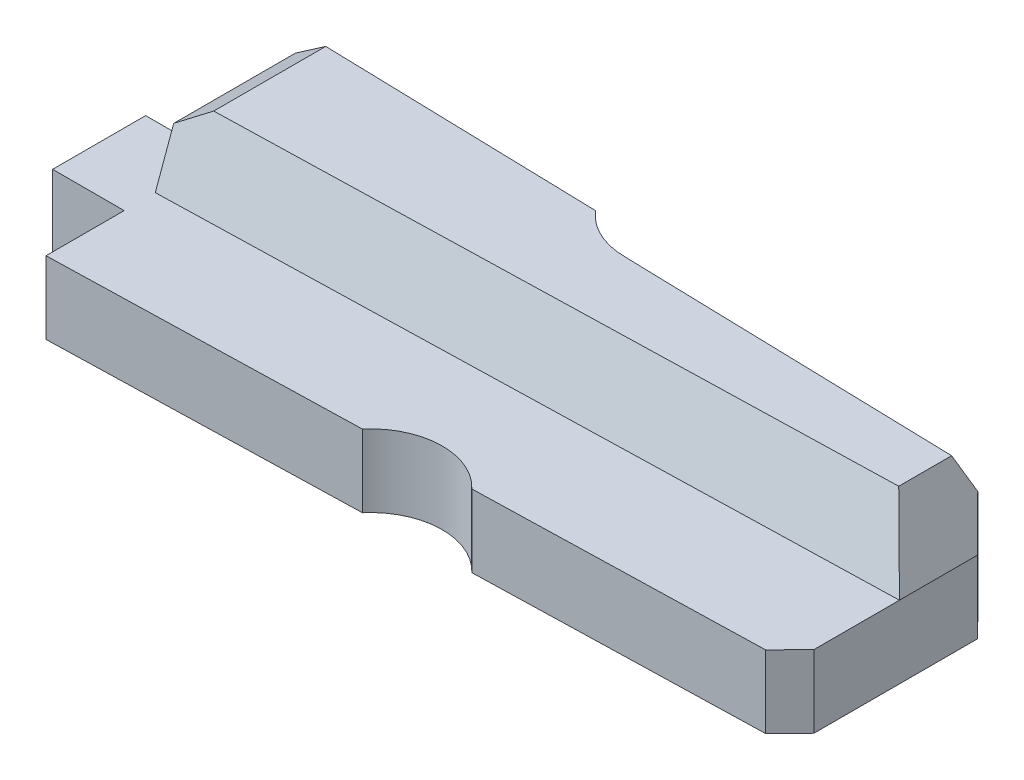
ISO-10303-21;
HEADER;
FILE_DESCRIPTION(('STEP AP214'),'2;1');
FILE_NAME('part.step','',(''),(''),'','','');
FILE_SCHEMA(('AUTOMOTIVE_DESIGN { 1 0 10303 214 1 1 1 1 }'));
ENDSEC;
DATA;
#1=APPLICATION_CONTEXT('core data for automotive mechanical design processes');
#2=APPLICATION_PROTOCOL_DEFINITION('international standard','automotive_design',2000,#1);
#3=PRODUCT_CONTEXT('',#1,'mechanical');
#4=PRODUCT('Part','Part','',(#3));
#5=PRODUCT_RELATED_PRODUCT_CATEGORY('part','',(#4));
#6=PRODUCT_DEFINITION_FORMATION('','',#4);
#7=PRODUCT_DEFINITION_CONTEXT('part definition',#1,'design');
#8=PRODUCT_DEFINITION('design','',#6,#7);
#9=PRODUCT_DEFINITION_SHAPE('','',#8);
#10=(LENGTH_UNIT() NAMED_UNIT(*) SI_UNIT(.MILLI.,.METRE.));
#11=(NAMED_UNIT(*) PLANE_ANGLE_UNIT() SI_UNIT($,.RADIAN.));
#12=(NAMED_UNIT(*) SI_UNIT($,.STERADIAN.) SOLID_ANGLE_UNIT());
#13=UNCERTAINTY_MEASURE_WITH_UNIT(LENGTH_MEASURE(1.E-05),#10,'distance_accuracy_value','');
#14=(GEOMETRIC_REPRESENTATION_CONTEXT(3) GLOBAL_UNCERTAINTY_ASSIGNED_CONTEXT((#13)) GLOBAL_UNIT_ASSIGNED_CONTEXT((#10,
#11,#12)) REPRESENTATION_CONTEXT('',''));
#15=CARTESIAN_POINT('',(0.,0.,0.));
#16=DIRECTION('',(0.,0.,1.));
#17=DIRECTION('',(1.,0.,0.));
#18=AXIS2_PLACEMENT_3D('',#15,#16,#17);
#19=CARTESIAN_POINT('',(-3.21404762394943,0.,0.));
#20=DIRECTION('',(-1.,0.,0.));
#21=DIRECTION('',(0.,0.,1.));
#22=AXIS2_PLACEMENT_3D('',#19,#20,#21);
#23=PLANE('',#22);
#24=DIRECTION('',(0.,-0.939654376033673,0.342125201645199));
#25=VECTOR('',#24,1.);
#26=CARTESIAN_POINT('',(-3.21404762394943,1.11739403174175,3.06894723519641));
#27=LINE('',#26,#25);
#28=CARTESIAN_POINT('',(-3.21404762394943,10.3388381168578,-0.28855154046747));
#29=VERTEX_POINT('',#28);
#30=CARTESIAN_POINT('',(-3.21404762394943,6.08,1.26207801723708));
#31=VERTEX_POINT('',#30);
#32=EDGE_CURVE('E38',#29,#31,#27,.T.);
#33=ORIENTED_EDGE('',*,*,#32,.F.);
#34=DIRECTION('',(0.,0.,1.));
#35=VECTOR('',#34,1.);
#36=CARTESIAN_POINT('',(-3.21404762394943,10.3388381168578,0.));
#37=LINE('',#36,#35);
#38=CARTESIAN_POINT('',(-3.21404762394943,10.3388381168578,-10.4866526126494));
#39=VERTEX_POINT('',#38);
#40=EDGE_CURVE('E50',#39,#29,#37,.T.);
#41=ORIENTED_EDGE('',*,*,#40,.F.);
#42=DIRECTION('',(0.,-1.,0.));
#43=VECTOR('',#42,1.);
#44=CARTESIAN_POINT('',(-3.21404762394943,6.08,-10.4866526126494));
#45=LINE('',#44,#43);
#46=CARTESIAN_POINT('',(-3.21404762394943,0.,-10.4866526126494));
#47=VERTEX_POINT('',#46);
#48=EDGE_CURVE('E321',#39,#47,#45,.T.);
#49=ORIENTED_EDGE('',*,*,#48,.T.);
#50=DIRECTION('',(0.,0.,1.));
#51=VECTOR('',#50,1.);
#52=CARTESIAN_POINT('',(-3.21404762394943,0.,0.));
#53=LINE('',#52,#51);
#54=CARTESIAN_POINT('',(-3.21404762394943,0.,-3.93069399195972));
#55=VERTEX_POINT('',#54);
#56=EDGE_CURVE('E355',#47,#55,#53,.T.);
#57=ORIENTED_EDGE('',*,*,#56,.T.);
#58=DIRECTION('',(0.,-1.,0.));
#59=VECTOR('',#58,1.);
#60=CARTESIAN_POINT('',(-3.21404762394943,6.08,-3.93069399195972));
#61=LINE('',#60,#59);
#62=CARTESIAN_POINT('',(-3.21404762394943,6.08,-3.93069399195972));
#63=VERTEX_POINT('',#62);
#64=EDGE_CURVE('E58',#63,#55,#61,.T.);
#65=ORIENTED_EDGE('',*,*,#64,.F.);
#66=DIRECTION('',(0.,0.,-1.));
#67=VECTOR('',#66,1.);
#68=CARTESIAN_POINT('',(-3.21404762394943,6.08,-3.93069399195972));
#69=LINE('',#68,#67);
#70=EDGE_CURVE('E11',#31,#63,#69,.T.);
#71=ORIENTED_EDGE('',*,*,#70,.F.);
#72=EDGE_LOOP('',(#33,#41,#49,#57,#65,#71));
#73=FACE_BOUND('',#72,.T.);
#74=ADVANCED_FACE('F34',(#73),#23,.T.);
#75=CARTESIAN_POINT('',(0.,12.17,0.));
#76=DIRECTION('',(0.,1.,0.));
#77=DIRECTION('',(0.,0.,1.));
#78=AXIS2_PLACEMENT_3D('',#75,#76,#77);
#79=PLANE('',#78);
#80=DIRECTION('',(-0.999650437608878,0.,-0.0264386570835047));
#81=VECTOR('',#80,1.);
#82=CARTESIAN_POINT('',(57.5859523760506,12.17,-8.87862015430114));
#83=LINE('',#82,#81);
#84=CARTESIAN_POINT('',(22.6396250832548,12.17,-9.80287720342739));
#85=VERTEX_POINT('',#84);
#86=CARTESIAN_POINT('',(-0.598877430517785,12.17,-10.4174868469398));
#87=VERTEX_POINT('',#86);
#88=EDGE_CURVE('E182',#85,#87,#83,.T.);
#89=ORIENTED_EDGE('',*,*,#88,.T.);
#90=DIRECTION('',(0.,0.,-1.));
#91=VECTOR('',#90,1.);
#92=CARTESIAN_POINT('',(-0.598877430517784,12.17,0.));
#93=LINE('',#92,#91);
#94=CARTESIAN_POINT('',(-0.598877430517782,12.17,-1.02425918340833));
#95=VERTEX_POINT('',#94);
#96=EDGE_CURVE('E169',#95,#87,#93,.T.);
#97=ORIENTED_EDGE('',*,*,#96,.F.);
#98=DIRECTION('',(0.99965223762999,0.,-0.0263705100700281));
#99=VECTOR('',#98,1.);
#100=CARTESIAN_POINT('',(-0.027417305608043,12.17,-1.03933412088287));
#101=LINE('',#100,#99);
#102=CARTESIAN_POINT('',(55.3693736493694,12.17,-2.5006839570908));
#103=VERTEX_POINT('',#102);
#104=EDGE_CURVE('E179',#95,#103,#101,.T.);
#105=ORIENTED_EDGE('',*,*,#104,.T.);
#106=DIRECTION('',(0.,0.,1.));
#107=VECTOR('',#106,1.);
#108=CARTESIAN_POINT('',(55.3693736493694,12.17,0.));
#109=LINE('',#108,#107);
#110=CARTESIAN_POINT('',(55.3693736493694,12.17,-6.93654464259486));
#111=VERTEX_POINT('',#110);
#112=EDGE_CURVE('E219',#111,#103,#109,.T.);
#113=ORIENTED_EDGE('',*,*,#112,.F.);
#114=DIRECTION('',(0.999650437608878,0.,0.0264386570835047));
#115=VECTOR('',#114,1.);
#116=CARTESIAN_POINT('',(0.222032153378399,12.17,-8.39507614123248));
#117=LINE('',#116,#115);
#118=CARTESIAN_POINT('',(27.21912150548,12.17,-7.68105976032612));
#119=VERTEX_POINT('',#118);
#120=EDGE_CURVE('E264',#119,#111,#117,.T.);
#121=ORIENTED_EDGE('',*,*,#120,.F.);
#122=DIRECTION('',(0.021894705545115,0.,-0.999760282202235));
#123=VECTOR('',#122,1.);
#124=CARTESIAN_POINT('',(27.0379390265918,12.17,0.5921296575515));
#125=LINE('',#124,#123);
#126=CARTESIAN_POINT('',(27.2191693084174,12.17,-7.68324254730575));
#127=VERTEX_POINT('',#126);
#128=EDGE_CURVE('E261',#119,#127,#125,.T.);
#129=ORIENTED_EDGE('',*,*,#128,.T.);
#130=CARTESIAN_POINT('',(27.2159523760506,12.17,-13.6832416849179));
#131=DIRECTION('',(0.,-1.,0.));
#132=DIRECTION('',(0.,0.,-1.));
#133=AXIS2_PLACEMENT_3D('',#130,#131,#132);
#134=CIRCLE('',#133,6.);
#135=EDGE_CURVE('E260',#127,#85,#134,.T.);
#136=ORIENTED_EDGE('',*,*,#135,.T.);
#137=EDGE_LOOP('',(#89,#97,#105,#113,#121,#129,#136));
#138=FACE_BOUND('',#137,.T.);
#139=ADVANCED_FACE('F177',(#138),#79,.T.);
#140=CARTESIAN_POINT('',(57.5859523760506,6.08,-8.87862015430114));
#141=DIRECTION('',(-0.0264386570835048,0.,0.999650437608878));
#142=DIRECTION('',(0.999650437608878,0.,0.0264386570835048));
#143=AXIS2_PLACEMENT_3D('',#140,#141,#142);
#144=PLANE('',#143);
#145=DIRECTION('',(0.818959870932192,0.573441875117969,0.0216597706339415));
#146=VECTOR('',#145,1.);
#147=CARTESIAN_POINT('',(-5.72776976618249,8.57871092390159,-10.5531352902148));
#148=LINE('',#147,#146);
#149=EDGE_CURVE('E320',#39,#87,#148,.T.);
#150=ORIENTED_EDGE('',*,*,#149,.T.);
#151=ORIENTED_EDGE('',*,*,#88,.F.);
#152=DIRECTION('',(0.,-1.,0.));
#153=VECTOR('',#152,1.);
#154=CARTESIAN_POINT('',(22.6396250832548,12.17,-9.8028772034274));
#155=LINE('',#154,#153);
#156=CARTESIAN_POINT('',(22.6396250832548,0.,-9.80287720342739));
#157=VERTEX_POINT('',#156);
#158=EDGE_CURVE('E279',#85,#157,#155,.T.);
#159=ORIENTED_EDGE('',*,*,#158,.T.);
#160=DIRECTION('',(-0.999650437608878,0.,-0.0264386570835048));
#161=VECTOR('',#160,1.);
#162=CARTESIAN_POINT('',(57.5859523760506,0.,-8.87862015430114));
#163=LINE('',#162,#161);
#164=EDGE_CURVE('E221',#157,#47,#163,.T.);
#165=ORIENTED_EDGE('',*,*,#164,.T.);
#166=ORIENTED_EDGE('',*,*,#48,.F.);
#167=EDGE_LOOP('',(#150,#151,#159,#165,#166));
#168=FACE_BOUND('',#167,.T.);
#169=ADVANCED_FACE('F318',(#168),#144,.F.);
#170=CARTESIAN_POINT('',(0.0789345368539797,1.08946781060145,2.99224725584853));
#171=DIRECTION('',(0.024780173719166,0.342020143325666,0.939365831053024));
#172=DIRECTION('',(0.,-0.939654376033673,0.342125201645199));
#173=AXIS2_PLACEMENT_3D('',#170,#171,#172);
#174=PLANE('',#173);
#175=ORIENTED_EDGE('',*,*,#104,.F.);
#176=DIRECTION('',(0.798230972464766,0.558927344152294,-0.224560768071401));
#177=VECTOR('',#176,1.);
#178=CARTESIAN_POINT('',(-5.83057238127445,8.50672775786652,0.447537172513004));
#179=LINE('',#178,#177);
#180=EDGE_CURVE('E166',#29,#95,#179,.T.);
#181=ORIENTED_EDGE('',*,*,#180,.F.);
#182=ORIENTED_EDGE('',*,*,#32,.T.);
#183=DIRECTION('',(0.99965223762999,0.,-0.0263705100700281));
#184=VECTOR('',#183,1.);
#185=CARTESIAN_POINT('',(-13.0640476239494,6.08,1.52191790396169));
#186=LINE('',#185,#184);
#187=CARTESIAN_POINT('',(57.5859523760505,6.08000000000001,-0.341806765794));
#188=VERTEX_POINT('',#187);
#189=EDGE_CURVE('E212',#31,#188,#186,.T.);
#190=ORIENTED_EDGE('',*,*,#189,.T.);
#191=DIRECTION('',(0.324489875800026,-0.891528606602206,0.316042820062746));
#192=VECTOR('',#191,1.);
#193=CARTESIAN_POINT('',(53.3164641697192,17.8103224395232,-4.50015250655652));
#194=LINE('',#193,#192);
#195=EDGE_CURVE('E187',#103,#188,#194,.T.);
#196=ORIENTED_EDGE('',*,*,#195,.F.);
#197=EDGE_LOOP('',(#175,#181,#182,#190,#196));
#198=FACE_BOUND('',#197,.T.);
#199=ADVANCED_FACE('F185',(#198),#174,.T.);
#200=CARTESIAN_POINT('',(-14.9140476239494,6.08,10.7339069307277));
#201=DIRECTION('',(-0.0263705100700281,0.,-0.99965223762999));
#202=DIRECTION('',(-0.99965223762999,0.,0.0263705100700281));
#203=AXIS2_PLACEMENT_3D('',#200,#201,#202);
#204=PLANE('',#203);
#205=DIRECTION('',(0.,1.,0.));
#206=VECTOR('',#205,1.);
#207=CARTESIAN_POINT('',(-3.21404762394943,6.08,10.4252646287299));
#208=LINE('',#207,#206);
#209=CARTESIAN_POINT('',(-3.21404762394943,0.,10.4252646287299));
#210=VERTEX_POINT('',#209);
#211=CARTESIAN_POINT('',(-3.21404762394943,6.08,10.4252646287299));
#212=VERTEX_POINT('',#211);
#213=EDGE_CURVE('E351',#210,#212,#208,.T.);
#214=ORIENTED_EDGE('',*,*,#213,.F.);
#215=DIRECTION('',(0.99965223762999,0.,-0.0263705100700281));
#216=VECTOR('',#215,1.);
#217=CARTESIAN_POINT('',(-14.9140476239494,0.,10.7339069307277));
#218=LINE('',#217,#216);
#219=CARTESIAN_POINT('',(22.6398896213696,0.,9.74324593581534));
#220=VERTEX_POINT('',#219);
#221=EDGE_CURVE('E233',#210,#220,#218,.T.);
#222=ORIENTED_EDGE('',*,*,#221,.T.);
#223=DIRECTION('',(0.,-1.,0.));
#224=VECTOR('',#223,1.);
#225=CARTESIAN_POINT('',(22.6398896213696,12.17,9.74324593581534));
#226=LINE('',#225,#224);
#227=CARTESIAN_POINT('',(22.6398896213696,6.08,9.74324593581534));
#228=VERTEX_POINT('',#227);
#229=EDGE_CURVE('E286',#220,#228,#226,.F.);
#230=ORIENTED_EDGE('',*,*,#229,.T.);
#231=DIRECTION('',(0.99965223762999,0.,-0.0263705100700281));
#232=VECTOR('',#231,1.);
#233=CARTESIAN_POINT('',(-14.9140476239494,6.08,10.7339069307277));
#234=LINE('',#233,#232);
#235=EDGE_CURVE('E193',#212,#228,#234,.T.);
#236=ORIENTED_EDGE('',*,*,#235,.F.);
#237=EDGE_LOOP('',(#214,#222,#230,#236));
#238=FACE_BOUND('',#237,.T.);
#239=ADVANCED_FACE('F414',(#238),#204,.F.);
#240=CARTESIAN_POINT('',(0.,6.08,0.));
#241=DIRECTION('',(0.,1.,0.));
#242=DIRECTION('',(0.,0.,1.));
#243=AXIS2_PLACEMENT_3D('',#240,#241,#242);
#244=PLANE('',#243);
#245=ORIENTED_EDGE('',*,*,#189,.F.);
#246=ORIENTED_EDGE('',*,*,#70,.T.);
#247=DIRECTION('',(1.,0.,0.));
#248=VECTOR('',#247,1.);
#249=CARTESIAN_POINT('',(-9.21404762394943,6.08,-3.93069399195971));
#250=LINE('',#249,#248);
#251=CARTESIAN_POINT('',(-9.21404762394943,6.08,-3.93069399195971));
#252=VERTEX_POINT('',#251);
#253=EDGE_CURVE('E335',#252,#63,#250,.T.);
#254=ORIENTED_EDGE('',*,*,#253,.F.);
#255=DIRECTION('',(0.,0.,-1.));
#256=VECTOR('',#255,1.);
#257=CARTESIAN_POINT('',(-9.21404762394943,6.08,-3.93069399195971));
#258=LINE('',#257,#256);
#259=CARTESIAN_POINT('',(-9.21404762394943,6.08,3.86930600804028));
#260=VERTEX_POINT('',#259);
#261=EDGE_CURVE('E334',#260,#252,#258,.T.);
#262=ORIENTED_EDGE('',*,*,#261,.F.);
#263=DIRECTION('',(1.,0.,0.));
#264=VECTOR('',#263,1.);
#265=CARTESIAN_POINT('',(-9.21404762394943,6.08,3.86930600804028));
#266=LINE('',#265,#264);
#267=CARTESIAN_POINT('',(-3.21404762394943,6.08,3.86930600804028));
#268=VERTEX_POINT('',#267);
#269=EDGE_CURVE('E340',#260,#268,#266,.T.);
#270=ORIENTED_EDGE('',*,*,#269,.T.);
#271=DIRECTION('',(0.,0.,1.));
#272=VECTOR('',#271,1.);
#273=CARTESIAN_POINT('',(-3.21404762394943,6.08,0.));
#274=LINE('',#273,#272);
#275=EDGE_CURVE('E349',#268,#212,#274,.T.);
#276=ORIENTED_EDGE('',*,*,#275,.T.);
#277=ORIENTED_EDGE('',*,*,#235,.T.);
#278=CARTESIAN_POINT('',(27.2159523760506,6.08,13.6239223800994));
#279=DIRECTION('',(0.,1.,0.));
#280=DIRECTION('',(0.,0.,1.));
#281=AXIS2_PLACEMENT_3D('',#278,#279,#280);
#282=CIRCLE('',#281,6.);
#283=CARTESIAN_POINT('',(31.5810510501713,6.08,9.50738092334364));
#284=VERTEX_POINT('',#283);
#285=EDGE_CURVE('E283',#284,#228,#282,.T.);
#286=ORIENTED_EDGE('',*,*,#285,.F.);
#287=CARTESIAN_POINT('',(55.5866479007906,6.08,8.87412086583891));
#288=VERTEX_POINT('',#287);
#289=EDGE_CURVE('E226',#284,#288,#234,.T.);
#290=ORIENTED_EDGE('',*,*,#289,.T.);
#291=DIRECTION('',(-0.697721108298284,0.,0.716369496164525));
#292=VECTOR('',#291,1.);
#293=CARTESIAN_POINT('',(32.9617654697762,6.08,32.1037113642797));
#294=LINE('',#293,#292);
#295=CARTESIAN_POINT('',(57.5859523760506,6.08,6.82137984569886));
#296=VERTEX_POINT('',#295);
#297=EDGE_CURVE('E281',#296,#288,#294,.T.);
#298=ORIENTED_EDGE('',*,*,#297,.F.);
#299=DIRECTION('',(0.,0.,-1.));
#300=VECTOR('',#299,1.);
#301=CARTESIAN_POINT('',(57.5859523760506,6.08,8.82137984569886));
#302=LINE('',#301,#300);
#303=EDGE_CURVE('E188',#296,#188,#302,.T.);
#304=ORIENTED_EDGE('',*,*,#303,.T.);
#305=EDGE_LOOP('',(#245,#246,#254,#262,#270,#276,#277,#286,#290,#298,#304));
#306=FACE_BOUND('',#305,.T.);
#307=ADVANCED_FACE('F216',(#306),#244,.T.);
#308=CARTESIAN_POINT('',(0.,0.,0.));
#309=DIRECTION('',(0.,1.,0.));
#310=DIRECTION('',(0.,0.,1.));
#311=AXIS2_PLACEMENT_3D('',#308,#309,#310);
#312=PLANE('',#311);
#313=ORIENTED_EDGE('',*,*,#56,.F.);
#314=ORIENTED_EDGE('',*,*,#164,.F.);
#315=CARTESIAN_POINT('',(27.2159523760506,0.,-13.6832416849179));
#316=DIRECTION('',(0.,-1.,0.));
#317=DIRECTION('',(0.,0.,-1.));
#318=AXIS2_PLACEMENT_3D('',#315,#316,#317);
#319=CIRCLE('',#318,6.);
#320=CARTESIAN_POINT('',(31.5807704121783,0.,-9.56640266553731));
#321=VERTEX_POINT('',#320);
#322=EDGE_CURVE('E256',#321,#157,#319,.T.);
#323=ORIENTED_EDGE('',*,*,#322,.F.);
#324=CARTESIAN_POINT('',(55.5859523760505,0.,-8.93151595885207));
#325=VERTEX_POINT('',#324);
#326=EDGE_CURVE('E230',#325,#321,#163,.T.);
#327=ORIENTED_EDGE('',*,*,#326,.F.);
#328=DIRECTION('',(-0.697818645624426,0.,-0.716274484969897));
#329=VECTOR('',#328,1.);
#330=CARTESIAN_POINT('',(57.5859523760506,0.,-6.87862015430114));
#331=LINE('',#330,#329);
#332=CARTESIAN_POINT('',(57.5859523760506,0.,-6.87862015430114));
#333=VERTEX_POINT('',#332);
#334=EDGE_CURVE('E253',#333,#325,#331,.T.);
#335=ORIENTED_EDGE('',*,*,#334,.F.);
#336=DIRECTION('',(0.,0.,-1.));
#337=VECTOR('',#336,1.);
#338=CARTESIAN_POINT('',(57.5859523760506,0.,8.82137984569886));
#339=LINE('',#338,#337);
#340=CARTESIAN_POINT('',(57.5859523760506,0.,6.82137984569886));
#341=VERTEX_POINT('',#340);
#342=EDGE_CURVE('E196',#341,#333,#339,.T.);
#343=ORIENTED_EDGE('',*,*,#342,.F.);
#344=DIRECTION('',(0.697721108298284,0.,-0.716369496164525));
#345=VECTOR('',#344,1.);
#346=CARTESIAN_POINT('',(57.5859523760506,0.,6.82137984569886));
#347=LINE('',#346,#345);
#348=CARTESIAN_POINT('',(55.5866479007906,0.,8.87412086583891));
#349=VERTEX_POINT('',#348);
#350=EDGE_CURVE('E270',#349,#341,#347,.T.);
#351=ORIENTED_EDGE('',*,*,#350,.F.);
#352=CARTESIAN_POINT('',(31.5810510501713,0.,9.50738092334364));
#353=VERTEX_POINT('',#352);
#354=EDGE_CURVE('E231',#353,#349,#218,.T.);
#355=ORIENTED_EDGE('',*,*,#354,.F.);
#356=CARTESIAN_POINT('',(27.2159523760506,0.,13.6239223800994));
#357=DIRECTION('',(0.,1.,0.));
#358=DIRECTION('',(0.,0.,1.));
#359=AXIS2_PLACEMENT_3D('',#356,#357,#358);
#360=CIRCLE('',#359,6.);
#361=EDGE_CURVE('E201',#353,#220,#360,.T.);
#362=ORIENTED_EDGE('',*,*,#361,.T.);
#363=ORIENTED_EDGE('',*,*,#221,.F.);
#364=CARTESIAN_POINT('',(-3.21404762394943,0.,3.86930600804028));
#365=VERTEX_POINT('',#364);
#366=EDGE_CURVE('E354',#365,#210,#53,.T.);
#367=ORIENTED_EDGE('',*,*,#366,.F.);
#368=DIRECTION('',(1.,0.,0.));
#369=VECTOR('',#368,1.);
#370=CARTESIAN_POINT('',(-9.21404762394943,0.,3.86930600804029));
#371=LINE('',#370,#369);
#372=CARTESIAN_POINT('',(-9.21404762394943,0.,3.86930600804029));
#373=VERTEX_POINT('',#372);
#374=EDGE_CURVE('E343',#373,#365,#371,.T.);
#375=ORIENTED_EDGE('',*,*,#374,.F.);
#376=DIRECTION('',(0.,0.,1.));
#377=VECTOR('',#376,1.);
#378=CARTESIAN_POINT('',(-9.21404762394943,0.,-3.93069399195972));
#379=LINE('',#378,#377);
#380=CARTESIAN_POINT('',(-9.21404762394943,0.,-3.93069399195972));
#381=VERTEX_POINT('',#380);
#382=EDGE_CURVE('E330',#381,#373,#379,.T.);
#383=ORIENTED_EDGE('',*,*,#382,.F.);
#384=DIRECTION('',(1.,0.,0.));
#385=VECTOR('',#384,1.);
#386=CARTESIAN_POINT('',(-9.21404762394943,0.,-3.93069399195972));
#387=LINE('',#386,#385);
#388=EDGE_CURVE('E346',#381,#55,#387,.T.);
#389=ORIENTED_EDGE('',*,*,#388,.T.);
#390=EDGE_LOOP('',(#313,#314,#323,#327,#335,#343,#351,#355,#362,#363,#367,#375,#383,#389));
#391=FACE_BOUND('',#390,.T.);
#392=ADVANCED_FACE('F251',(#391),#312,.F.);
#393=CARTESIAN_POINT('',(27.2159523760506,12.17,-13.6832416849179));
#394=DIRECTION('',(0.,-1.,0.));
#395=DIRECTION('',(0.,0.,-1.));
#396=AXIS2_PLACEMENT_3D('',#393,#394,#395);
#397=CYLINDRICAL_SURFACE('',#396,6.);
#398=CARTESIAN_POINT('',(27.2159523760506,-1.31965032331598,-13.6832416849179));
#399=DIRECTION('',(0.999710528962289,-0.00997636519554389,0.0218936159513814));
#400=DIRECTION('',(-0.00997397368324952,-0.999950234830457,-0.000218429578366967));
#401=AXIS2_PLACEMENT_3D('',#398,#399,#400);
#402=ELLIPSE('',#401,601.421447831521,6.);
#403=CARTESIAN_POINT('',(27.2191215123518,12.1652105128223,-7.68324252187));
#404=VERTEX_POINT('',#403);
#405=EDGE_CURVE('E206',#404,#127,#402,.F.);
#406=ORIENTED_EDGE('',*,*,#405,.F.);
#407=CARTESIAN_POINT('',(27.2159523760506,-1.00000000000002,-13.6832416849179));
#408=DIRECTION('',(-0.0240594738146314,-0.414583685995028,0.9096930850713));
#409=DIRECTION('',(0.010961035906438,-0.910011190759089,-0.414438763130432));
#410=AXIS2_PLACEMENT_3D('',#407,#408,#409);
#411=ELLIPSE('',#410,14.4723494982674,6.);
#412=CARTESIAN_POINT('',(31.5807704121783,7.78,-9.56640266553731));
#413=VERTEX_POINT('',#412);
#414=EDGE_CURVE('E204',#404,#413,#411,.F.);
#415=ORIENTED_EDGE('',*,*,#414,.T.);
#416=DIRECTION('',(0.,-1.,0.));
#417=VECTOR('',#416,1.);
#418=CARTESIAN_POINT('',(31.5807704121783,12.17,-9.56640266553731));
#419=LINE('',#418,#417);
#420=EDGE_CURVE('E243',#321,#413,#419,.F.);
#421=ORIENTED_EDGE('',*,*,#420,.F.);
#422=ORIENTED_EDGE('',*,*,#322,.T.);
#423=ORIENTED_EDGE('',*,*,#158,.F.);
#424=ORIENTED_EDGE('',*,*,#135,.F.);
#425=EDGE_LOOP('',(#406,#415,#421,#422,#423,#424));
#426=FACE_BOUND('',#425,.T.);
#427=ADVANCED_FACE('F316',(#426),#397,.F.);
#428=ORIENTED_EDGE('',*,*,#289,.F.);
#429=DIRECTION('',(0.,-1.,0.));
#430=VECTOR('',#429,1.);
#431=CARTESIAN_POINT('',(31.5810510501713,12.17,9.50738092334364));
#432=LINE('',#431,#430);
#433=EDGE_CURVE('E289',#284,#353,#432,.T.);
#434=ORIENTED_EDGE('',*,*,#433,.T.);
#435=ORIENTED_EDGE('',*,*,#354,.T.);
#436=DIRECTION('',(0.,-1.,0.));
#437=VECTOR('',#436,1.);
#438=CARTESIAN_POINT('',(55.5866479007906,12.17,8.87412086583891));
#439=LINE('',#438,#437);
#440=EDGE_CURVE('E274',#288,#349,#439,.T.);
#441=ORIENTED_EDGE('',*,*,#440,.F.);
#442=EDGE_LOOP('',(#428,#434,#435,#441));
#443=FACE_BOUND('',#442,.T.);
#444=ADVANCED_FACE('F459',(#443),#204,.F.);
#445=CARTESIAN_POINT('',(57.5859523760506,6.08,8.82137984569886));
#446=DIRECTION('',(-1.,0.,0.));
#447=DIRECTION('',(0.,0.,1.));
#448=AXIS2_PLACEMENT_3D('',#445,#446,#447);
#449=PLANE('',#448);
#450=ORIENTED_EDGE('',*,*,#342,.T.);
#451=DIRECTION('',(0.,-1.,0.));
#452=VECTOR('',#451,1.);
#453=CARTESIAN_POINT('',(57.5859523760506,12.17,-6.87862015430114));
#454=LINE('',#453,#452);
#455=CARTESIAN_POINT('',(57.5859523760506,6.08000000000001,-6.87862015430114));
#456=VERTEX_POINT('',#455);
#457=EDGE_CURVE('E268',#456,#333,#454,.T.);
#458=ORIENTED_EDGE('',*,*,#457,.F.);
#459=DIRECTION('',(0.,0.,-1.));
#460=VECTOR('',#459,1.);
#461=CARTESIAN_POINT('',(57.5859523760505,6.07999999999999,14.2417816919841));
#462=LINE('',#461,#460);
#463=EDGE_CURVE('E223',#188,#456,#462,.T.);
#464=ORIENTED_EDGE('',*,*,#463,.F.);
#465=ORIENTED_EDGE('',*,*,#303,.F.);
#466=DIRECTION('',(0.,-1.,0.));
#467=VECTOR('',#466,1.);
#468=CARTESIAN_POINT('',(57.5859523760506,12.17,6.82137984569886));
#469=LINE('',#468,#467);
#470=EDGE_CURVE('E273',#296,#341,#469,.T.);
#471=ORIENTED_EDGE('',*,*,#470,.T.);
#472=EDGE_LOOP('',(#450,#458,#464,#465,#471));
#473=FACE_BOUND('',#472,.T.);
#474=ADVANCED_FACE('F298',(#473),#449,.F.);
#475=ORIENTED_EDGE('',*,*,#420,.T.);
#476=DIRECTION('',(-0.999650437608878,0.,-0.0264386570835047));
#477=VECTOR('',#476,1.);
#478=CARTESIAN_POINT('',(27.2191278040723,7.78,-9.68175896299699));
#479=LINE('',#478,#477);
#480=CARTESIAN_POINT('',(55.5859523760506,7.78,-8.93151595885207));
#481=VERTEX_POINT('',#480);
#482=EDGE_CURVE('E309',#481,#413,#479,.T.);
#483=ORIENTED_EDGE('',*,*,#482,.F.);
#484=DIRECTION('',(0.,-1.,0.));
#485=VECTOR('',#484,1.);
#486=CARTESIAN_POINT('',(55.5859523760505,12.17,-8.93151595885207));
#487=LINE('',#486,#485);
#488=EDGE_CURVE('E245',#481,#325,#487,.T.);
#489=ORIENTED_EDGE('',*,*,#488,.T.);
#490=ORIENTED_EDGE('',*,*,#326,.T.);
#491=EDGE_LOOP('',(#475,#483,#489,#490));
#492=FACE_BOUND('',#491,.T.);
#493=ADVANCED_FACE('F36',(#492),#144,.F.);
#494=CARTESIAN_POINT('',(52.8037499311661,19.2189932325806,0.));
#495=DIRECTION('',(-0.939692620785908,-0.342020143325669,0.));
#496=DIRECTION('',(0.342020143325669,-0.939692620785908,0.));
#497=AXIS2_PLACEMENT_3D('',#494,#495,#496);
#498=PLANE('',#497);
#499=DIRECTION('',(-0.322711175379799,0.886641667361658,-0.331246209009444));
#500=VECTOR('',#499,1.);
#501=CARTESIAN_POINT('',(54.0637754066097,15.7571016908619,-10.4939513160267));
#502=LINE('',#501,#500);
#503=CARTESIAN_POINT('',(56.3538960107584,9.46504704313567,-8.14326182594045));
#504=VERTEX_POINT('',#503);
#505=EDGE_CURVE('E190',#456,#504,#502,.T.);
#506=ORIENTED_EDGE('',*,*,#505,.T.);
#507=DIRECTION('',(-0.315425349519909,0.866624025329529,0.386613046342058));
#508=VECTOR('',#507,1.);
#509=CARTESIAN_POINT('',(52.3413381430096,20.4894591790302,-3.22511804569174));
#510=LINE('',#509,#508);
#511=EDGE_CURVE('E304',#504,#111,#510,.T.);
#512=ORIENTED_EDGE('',*,*,#511,.T.);
#513=ORIENTED_EDGE('',*,*,#112,.T.);
#514=ORIENTED_EDGE('',*,*,#195,.T.);
#515=ORIENTED_EDGE('',*,*,#463,.T.);
#516=EDGE_LOOP('',(#506,#512,#513,#514,#515));
#517=FACE_BOUND('',#516,.T.);
#518=ADVANCED_FACE('F294',(#517),#498,.F.);
#519=CARTESIAN_POINT('',(57.5859523760506,12.17,-6.87862015430114));
#520=DIRECTION('',(-0.716274484969897,0.,0.697818645624426));
#521=DIRECTION('',(0.697818645624426,0.,0.716274484969897));
#522=AXIS2_PLACEMENT_3D('',#519,#520,#521);
#523=PLANE('',#522);
#524=ORIENTED_EDGE('',*,*,#488,.F.);
#525=DIRECTION('',(0.381572330053857,0.837258488045522,0.391664117750142));
#526=VECTOR('',#525,1.);
#527=CARTESIAN_POINT('',(57.5864426351405,12.1695411636349,-6.87811692888664));
#528=LINE('',#527,#526);
#529=EDGE_CURVE('E302',#481,#504,#528,.T.);
#530=ORIENTED_EDGE('',*,*,#529,.T.);
#531=ORIENTED_EDGE('',*,*,#505,.F.);
#532=ORIENTED_EDGE('',*,*,#457,.T.);
#533=ORIENTED_EDGE('',*,*,#334,.T.);
#534=EDGE_LOOP('',(#524,#530,#531,#532,#533));
#535=FACE_BOUND('',#534,.T.);
#536=ADVANCED_FACE('F300',(#535),#523,.F.);
#537=CARTESIAN_POINT('',(57.5859523760506,12.17,6.82137984569886));
#538=DIRECTION('',(-0.716369496164525,0.,-0.697721108298284));
#539=DIRECTION('',(-0.697721108298284,0.,0.716369496164525));
#540=AXIS2_PLACEMENT_3D('',#537,#538,#539);
#541=PLANE('',#540);
#542=ORIENTED_EDGE('',*,*,#297,.T.);
#543=ORIENTED_EDGE('',*,*,#440,.T.);
#544=ORIENTED_EDGE('',*,*,#350,.T.);
#545=ORIENTED_EDGE('',*,*,#470,.F.);
#546=EDGE_LOOP('',(#542,#543,#544,#545));
#547=FACE_BOUND('',#546,.T.);
#548=ADVANCED_FACE('F481',(#547),#541,.F.);
#549=CARTESIAN_POINT('',(27.2159523760506,12.17,13.6239223800994));
#550=DIRECTION('',(0.,-1.,0.));
#551=DIRECTION('',(0.,0.,-1.));
#552=AXIS2_PLACEMENT_3D('',#549,#550,#551);
#553=CYLINDRICAL_SURFACE('',#552,6.);
#554=ORIENTED_EDGE('',*,*,#285,.T.);
#555=ORIENTED_EDGE('',*,*,#229,.F.);
#556=ORIENTED_EDGE('',*,*,#361,.F.);
#557=ORIENTED_EDGE('',*,*,#433,.F.);
#558=EDGE_LOOP('',(#554,#555,#556,#557));
#559=FACE_BOUND('',#558,.T.);
#560=ADVANCED_FACE('F368',(#559),#553,.F.);
#561=CARTESIAN_POINT('',(0.305261025563002,5.26014168653883,-11.541974950739));
#562=DIRECTION('',(-0.0240594738146314,-0.414583685995028,0.9096930850713));
#563=DIRECTION('',(0.,-0.909956491120281,-0.414703730713947));
#564=AXIS2_PLACEMENT_3D('',#561,#562,#563);
#565=PLANE('',#564);
#566=ORIENTED_EDGE('',*,*,#120,.T.);
#567=ORIENTED_EDGE('',*,*,#511,.F.);
#568=ORIENTED_EDGE('',*,*,#529,.F.);
#569=ORIENTED_EDGE('',*,*,#482,.T.);
#570=ORIENTED_EDGE('',*,*,#414,.F.);
#571=DIRECTION('',(-1.3055683509995E-06,0.909956504149655,0.414703702122412));
#572=VECTOR('',#571,1.);
#573=CARTESIAN_POINT('',(27.2191215066618,12.1691762983604,-7.68143515422442));
#574=LINE('',#573,#572);
#575=EDGE_CURVE('E305',#404,#119,#574,.T.);
#576=ORIENTED_EDGE('',*,*,#575,.T.);
#577=EDGE_LOOP('',(#566,#567,#568,#569,#570,#576));
#578=FACE_BOUND('',#577,.T.);
#579=ADVANCED_FACE('F314',(#578),#565,.F.);
#580=CARTESIAN_POINT('',(27.4859410712661,16.7669093760453,-17.7699314676651));
#581=DIRECTION('',(0.999710528962289,-0.00997636519554389,0.0218936159513814));
#582=DIRECTION('',(0.021894705545115,0.,-0.999760282202235));
#583=AXIS2_PLACEMENT_3D('',#580,#581,#582);
#584=PLANE('',#583);
#585=ORIENTED_EDGE('',*,*,#575,.F.);
#586=ORIENTED_EDGE('',*,*,#405,.T.);
#587=ORIENTED_EDGE('',*,*,#128,.F.);
#588=EDGE_LOOP('',(#585,#586,#587));
#589=FACE_BOUND('',#588,.T.);
#590=ADVANCED_FACE('F357',(#589),#584,.T.);
#591=DIRECTION('',(0.,1.,0.));
#592=VECTOR('',#591,1.);
#593=CARTESIAN_POINT('',(-3.21404762394943,6.08,3.86930600804028));
#594=LINE('',#593,#592);
#595=EDGE_CURVE('E323',#365,#268,#594,.T.);
#596=ORIENTED_EDGE('',*,*,#595,.F.);
#597=ORIENTED_EDGE('',*,*,#366,.T.);
#598=ORIENTED_EDGE('',*,*,#213,.T.);
#599=ORIENTED_EDGE('',*,*,#275,.F.);
#600=EDGE_LOOP('',(#596,#597,#598,#599));
#601=FACE_BOUND('',#600,.T.);
#602=ADVANCED_FACE('F359',(#601),#23,.T.);
#603=CARTESIAN_POINT('',(-9.21404762394943,6.08,-3.93069399195971));
#604=DIRECTION('',(0.,0.,1.));
#605=DIRECTION('',(1.,0.,0.));
#606=AXIS2_PLACEMENT_3D('',#603,#604,#605);
#607=PLANE('',#606);
#608=ORIENTED_EDGE('',*,*,#64,.T.);
#609=ORIENTED_EDGE('',*,*,#388,.F.);
#610=DIRECTION('',(0.,-1.,0.));
#611=VECTOR('',#610,1.);
#612=CARTESIAN_POINT('',(-9.21404762394943,6.08,-3.93069399195971));
#613=LINE('',#612,#611);
#614=EDGE_CURVE('E327',#252,#381,#613,.T.);
#615=ORIENTED_EDGE('',*,*,#614,.F.);
#616=ORIENTED_EDGE('',*,*,#253,.T.);
#617=EDGE_LOOP('',(#608,#609,#615,#616));
#618=FACE_BOUND('',#617,.T.);
#619=ADVANCED_FACE('F365',(#618),#607,.F.);
#620=CARTESIAN_POINT('',(-9.21404762394943,6.08,3.86930600804028));
#621=DIRECTION('',(0.,0.,-1.));
#622=DIRECTION('',(-1.,0.,0.));
#623=AXIS2_PLACEMENT_3D('',#620,#621,#622);
#624=PLANE('',#623);
#625=ORIENTED_EDGE('',*,*,#595,.T.);
#626=ORIENTED_EDGE('',*,*,#269,.F.);
#627=DIRECTION('',(0.,1.,0.));
#628=VECTOR('',#627,1.);
#629=CARTESIAN_POINT('',(-9.21404762394943,6.08,3.86930600804028));
#630=LINE('',#629,#628);
#631=EDGE_CURVE('E332',#373,#260,#630,.T.);
#632=ORIENTED_EDGE('',*,*,#631,.F.);
#633=ORIENTED_EDGE('',*,*,#374,.T.);
#634=EDGE_LOOP('',(#625,#626,#632,#633));
#635=FACE_BOUND('',#634,.T.);
#636=ADVANCED_FACE('F380',(#635),#624,.F.);
#637=CARTESIAN_POINT('',(-9.21404762394943,0.,0.));
#638=DIRECTION('',(-1.,0.,0.));
#639=DIRECTION('',(0.,0.,1.));
#640=AXIS2_PLACEMENT_3D('',#637,#638,#639);
#641=PLANE('',#640);
#642=ORIENTED_EDGE('',*,*,#614,.T.);
#643=ORIENTED_EDGE('',*,*,#382,.T.);
#644=ORIENTED_EDGE('',*,*,#631,.T.);
#645=ORIENTED_EDGE('',*,*,#261,.T.);
#646=EDGE_LOOP('',(#642,#643,#644,#645));
#647=FACE_BOUND('',#646,.T.);
#648=ADVANCED_FACE('F384',(#647),#641,.T.);
#649=CARTESIAN_POINT('',(-5.91505424043103,8.44757292324311,0.));
#650=DIRECTION('',(-0.573576436351044,0.819152044288993,0.));
#651=DIRECTION('',(-0.819152044288993,-0.573576436351044,0.));
#652=AXIS2_PLACEMENT_3D('',#649,#650,#651);
#653=PLANE('',#652);
#654=ORIENTED_EDGE('',*,*,#40,.T.);
#655=ORIENTED_EDGE('',*,*,#180,.T.);
#656=ORIENTED_EDGE('',*,*,#96,.T.);
#657=ORIENTED_EDGE('',*,*,#149,.F.);
#658=EDGE_LOOP('',(#654,#655,#656,#657));
#659=FACE_BOUND('',#658,.T.);
#660=ADVANCED_FACE('F168',(#659),#653,.T.);
#661=CLOSED_SHELL('',(#74,#139,#169,#199,#239,#307,#392,#427,#444,#474,#493,#518,#536,#548,#560,
#579,#590,#602,#619,#636,#648,#660));
#662=MANIFOLD_SOLID_BREP('B2',#661);
#663=ADVANCED_BREP_SHAPE_REPRESENTATION('',(#18,#662),#14);
#664=SHAPE_DEFINITION_REPRESENTATION(#9,#663);
ENDSEC;
END-ISO-10303-21;
